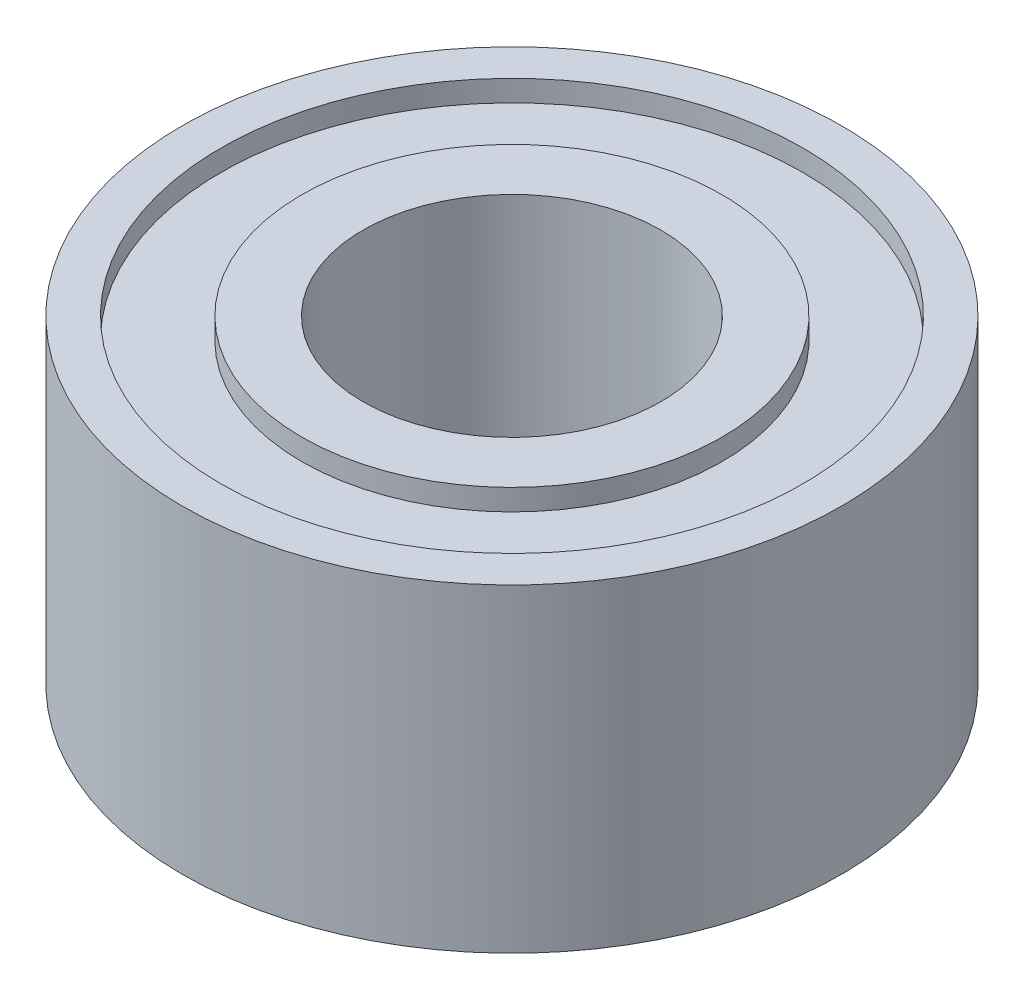
ISO-10303-21;
HEADER;
FILE_DESCRIPTION(('STEP AP214'),'2;1');
FILE_NAME('part.step','',(''),(''),'','','');
FILE_SCHEMA(('AUTOMOTIVE_DESIGN { 1 0 10303 214 1 1 1 1 }'));
ENDSEC;
DATA;
#1=APPLICATION_CONTEXT('core data for automotive mechanical design processes');
#2=APPLICATION_PROTOCOL_DEFINITION('international standard','automotive_design',2000,#1);
#3=PRODUCT_CONTEXT('',#1,'mechanical');
#4=PRODUCT('Part','Part','',(#3));
#5=PRODUCT_RELATED_PRODUCT_CATEGORY('part','',(#4));
#6=PRODUCT_DEFINITION_FORMATION('','',#4);
#7=PRODUCT_DEFINITION_CONTEXT('part definition',#1,'design');
#8=PRODUCT_DEFINITION('design','',#6,#7);
#9=PRODUCT_DEFINITION_SHAPE('','',#8);
#10=(LENGTH_UNIT() NAMED_UNIT(*) SI_UNIT(.MILLI.,.METRE.));
#11=(NAMED_UNIT(*) PLANE_ANGLE_UNIT() SI_UNIT($,.RADIAN.));
#12=(NAMED_UNIT(*) SI_UNIT($,.STERADIAN.) SOLID_ANGLE_UNIT());
#13=UNCERTAINTY_MEASURE_WITH_UNIT(LENGTH_MEASURE(1.E-05),#10,'distance_accuracy_value','');
#14=(GEOMETRIC_REPRESENTATION_CONTEXT(3) GLOBAL_UNCERTAINTY_ASSIGNED_CONTEXT((#13)) GLOBAL_UNIT_ASSIGNED_CONTEXT((#10,
#11,#12)) REPRESENTATION_CONTEXT('',''));
#15=CARTESIAN_POINT('',(0.,0.,0.));
#16=DIRECTION('',(0.,0.,1.));
#17=DIRECTION('',(1.,0.,0.));
#18=AXIS2_PLACEMENT_3D('',#15,#16,#17);
#19=CARTESIAN_POINT('',(0.,0.,0.));
#20=DIRECTION('',(0.,1.,0.));
#21=DIRECTION('',(0.,0.,1.));
#22=AXIS2_PLACEMENT_3D('',#19,#20,#21);
#23=PLANE('',#22);
#24=CARTESIAN_POINT('',(0.,0.,0.));
#25=DIRECTION('',(0.,1.,0.));
#26=DIRECTION('',(0.,0.,1.));
#27=AXIS2_PLACEMENT_3D('',#24,#25,#26);
#28=CIRCLE('',#27,7.);
#29=CARTESIAN_POINT('',(0.,0.,7.));
#30=VERTEX_POINT('',#29);
#31=EDGE_CURVE('E44',#30,#30,#28,.T.);
#32=ORIENTED_EDGE('',*,*,#31,.T.);
#33=EDGE_LOOP('',(#32));
#34=FACE_BOUND('',#33,.T.);
#35=CARTESIAN_POINT('',(0.,0.,0.));
#36=DIRECTION('',(0.,-1.,0.));
#37=DIRECTION('',(0.,0.,-1.));
#38=AXIS2_PLACEMENT_3D('',#35,#36,#37);
#39=CIRCLE('',#38,9.87953216799572);
#40=CARTESIAN_POINT('',(0.,0.,-9.87953216799572));
#41=VERTEX_POINT('',#40);
#42=EDGE_CURVE('E68',#41,#41,#39,.T.);
#43=ORIENTED_EDGE('',*,*,#42,.T.);
#44=EDGE_LOOP('',(#43));
#45=FACE_BOUND('',#44,.T.);
#46=ADVANCED_FACE('F31',(#34,#45),#23,.F.);
#47=CARTESIAN_POINT('',(0.,15.,0.));
#48=DIRECTION('',(0.,1.,0.));
#49=DIRECTION('',(0.,0.,1.));
#50=AXIS2_PLACEMENT_3D('',#47,#48,#49);
#51=PLANE('',#50);
#52=CARTESIAN_POINT('',(0.,15.,0.));
#53=DIRECTION('',(0.,1.,0.));
#54=DIRECTION('',(0.,0.,1.));
#55=AXIS2_PLACEMENT_3D('',#52,#53,#54);
#56=CIRCLE('',#55,7.);
#57=CARTESIAN_POINT('',(0.,15.,7.));
#58=VERTEX_POINT('',#57);
#59=EDGE_CURVE('E42',#58,#58,#56,.T.);
#60=ORIENTED_EDGE('',*,*,#59,.F.);
#61=EDGE_LOOP('',(#60));
#62=FACE_BOUND('',#61,.T.);
#63=CARTESIAN_POINT('',(0.,15.,0.));
#64=DIRECTION('',(0.,1.,0.));
#65=DIRECTION('',(0.,0.,1.));
#66=AXIS2_PLACEMENT_3D('',#63,#64,#65);
#67=CIRCLE('',#66,9.87953216799572);
#68=CARTESIAN_POINT('',(0.,15.,9.87953216799572));
#69=VERTEX_POINT('',#68);
#70=EDGE_CURVE('E56',#69,#69,#67,.T.);
#71=ORIENTED_EDGE('',*,*,#70,.T.);
#72=EDGE_LOOP('',(#71));
#73=FACE_BOUND('',#72,.T.);
#74=ADVANCED_FACE('F106',(#62,#73),#51,.T.);
#75=CARTESIAN_POINT('',(0.,15.,0.));
#76=DIRECTION('',(0.,1.,0.));
#77=DIRECTION('',(0.,0.,1.));
#78=AXIS2_PLACEMENT_3D('',#75,#76,#77);
#79=CIRCLE('',#78,13.6842569872599);
#80=CARTESIAN_POINT('',(0.,15.,13.6842569872599));
#81=VERTEX_POINT('',#80);
#82=EDGE_CURVE('E50',#81,#81,#79,.T.);
#83=ORIENTED_EDGE('',*,*,#82,.F.);
#84=EDGE_LOOP('',(#83));
#85=FACE_BOUND('',#84,.T.);
#86=CARTESIAN_POINT('',(0.,15.,0.));
#87=DIRECTION('',(0.,1.,0.));
#88=DIRECTION('',(0.,0.,1.));
#89=AXIS2_PLACEMENT_3D('',#86,#87,#88);
#90=CIRCLE('',#89,15.5);
#91=CARTESIAN_POINT('',(0.,15.,15.5));
#92=VERTEX_POINT('',#91);
#93=EDGE_CURVE('E10',#92,#92,#90,.T.);
#94=ORIENTED_EDGE('',*,*,#93,.T.);
#95=EDGE_LOOP('',(#94));
#96=FACE_BOUND('',#95,.T.);
#97=ADVANCED_FACE('F93',(#85,#96),#51,.T.);
#98=CARTESIAN_POINT('',(0.,0.,0.));
#99=DIRECTION('',(0.,-1.,0.));
#100=DIRECTION('',(0.,0.,-1.));
#101=AXIS2_PLACEMENT_3D('',#98,#99,#100);
#102=CIRCLE('',#101,13.6842569872599);
#103=CARTESIAN_POINT('',(0.,0.,-13.6842569872599));
#104=VERTEX_POINT('',#103);
#105=EDGE_CURVE('E62',#104,#104,#102,.T.);
#106=ORIENTED_EDGE('',*,*,#105,.F.);
#107=EDGE_LOOP('',(#106));
#108=FACE_BOUND('',#107,.T.);
#109=CARTESIAN_POINT('',(0.,0.,0.));
#110=DIRECTION('',(0.,1.,0.));
#111=DIRECTION('',(0.,0.,1.));
#112=AXIS2_PLACEMENT_3D('',#109,#110,#111);
#113=CIRCLE('',#112,15.5);
#114=CARTESIAN_POINT('',(0.,0.,15.5));
#115=VERTEX_POINT('',#114);
#116=EDGE_CURVE('E35',#115,#115,#113,.T.);
#117=ORIENTED_EDGE('',*,*,#116,.F.);
#118=EDGE_LOOP('',(#117));
#119=FACE_BOUND('',#118,.T.);
#120=ADVANCED_FACE('F90',(#108,#119),#23,.F.);
#121=CARTESIAN_POINT('',(0.,15.,0.));
#122=DIRECTION('',(0.,-1.,0.));
#123=DIRECTION('',(0.,0.,-1.));
#124=AXIS2_PLACEMENT_3D('',#121,#122,#123);
#125=CYLINDRICAL_SURFACE('',#124,15.5);
#126=ORIENTED_EDGE('',*,*,#93,.F.);
#127=EDGE_LOOP('',(#126));
#128=FACE_BOUND('',#127,.T.);
#129=ORIENTED_EDGE('',*,*,#116,.T.);
#130=EDGE_LOOP('',(#129));
#131=FACE_BOUND('',#130,.T.);
#132=ADVANCED_FACE('F33',(#128,#131),#125,.T.);
#133=CARTESIAN_POINT('',(0.,15.,0.));
#134=DIRECTION('',(0.,-1.,0.));
#135=DIRECTION('',(0.,0.,-1.));
#136=AXIS2_PLACEMENT_3D('',#133,#134,#135);
#137=CYLINDRICAL_SURFACE('',#136,7.);
#138=ORIENTED_EDGE('',*,*,#59,.T.);
#139=EDGE_LOOP('',(#138));
#140=FACE_BOUND('',#139,.T.);
#141=ORIENTED_EDGE('',*,*,#31,.F.);
#142=EDGE_LOOP('',(#141));
#143=FACE_BOUND('',#142,.T.);
#144=ADVANCED_FACE('F97',(#140,#143),#137,.F.);
#145=CARTESIAN_POINT('',(0.,14.,0.));
#146=DIRECTION('',(0.,1.,0.));
#147=DIRECTION('',(0.,0.,1.));
#148=AXIS2_PLACEMENT_3D('',#145,#146,#147);
#149=CYLINDRICAL_SURFACE('',#148,13.6842569872599);
#150=CARTESIAN_POINT('',(0.,14.,0.));
#151=DIRECTION('',(0.,1.,0.));
#152=DIRECTION('',(0.,0.,1.));
#153=AXIS2_PLACEMENT_3D('',#150,#151,#152);
#154=CIRCLE('',#153,13.6842569872599);
#155=CARTESIAN_POINT('',(0.,14.,13.6842569872599));
#156=VERTEX_POINT('',#155);
#157=EDGE_CURVE('E47',#156,#156,#154,.T.);
#158=ORIENTED_EDGE('',*,*,#157,.F.);
#159=EDGE_LOOP('',(#158));
#160=FACE_BOUND('',#159,.T.);
#161=ORIENTED_EDGE('',*,*,#82,.T.);
#162=EDGE_LOOP('',(#161));
#163=FACE_BOUND('',#162,.T.);
#164=ADVANCED_FACE('F102',(#160,#163),#149,.F.);
#165=CARTESIAN_POINT('',(0.,14.,0.));
#166=DIRECTION('',(0.,1.,0.));
#167=DIRECTION('',(0.,0.,1.));
#168=AXIS2_PLACEMENT_3D('',#165,#166,#167);
#169=PLANE('',#168);
#170=CARTESIAN_POINT('',(0.,14.,0.));
#171=DIRECTION('',(0.,1.,0.));
#172=DIRECTION('',(0.,0.,1.));
#173=AXIS2_PLACEMENT_3D('',#170,#171,#172);
#174=CIRCLE('',#173,9.87953216799572);
#175=CARTESIAN_POINT('',(0.,14.,9.87953216799572));
#176=VERTEX_POINT('',#175);
#177=EDGE_CURVE('E53',#176,#176,#174,.T.);
#178=ORIENTED_EDGE('',*,*,#177,.F.);
#179=EDGE_LOOP('',(#178));
#180=FACE_BOUND('',#179,.T.);
#181=ORIENTED_EDGE('',*,*,#157,.T.);
#182=EDGE_LOOP('',(#181));
#183=FACE_BOUND('',#182,.T.);
#184=ADVANCED_FACE('F119',(#180,#183),#169,.T.);
#185=CARTESIAN_POINT('',(0.,14.,0.));
#186=DIRECTION('',(0.,1.,0.));
#187=DIRECTION('',(0.,0.,1.));
#188=AXIS2_PLACEMENT_3D('',#185,#186,#187);
#189=CYLINDRICAL_SURFACE('',#188,9.87953216799572);
#190=ORIENTED_EDGE('',*,*,#177,.T.);
#191=EDGE_LOOP('',(#190));
#192=FACE_BOUND('',#191,.T.);
#193=ORIENTED_EDGE('',*,*,#70,.F.);
#194=EDGE_LOOP('',(#193));
#195=FACE_BOUND('',#194,.T.);
#196=ADVANCED_FACE('F86',(#192,#195),#189,.T.);
#197=CARTESIAN_POINT('',(0.,1.,0.));
#198=DIRECTION('',(0.,-1.,0.));
#199=DIRECTION('',(0.,0.,-1.));
#200=AXIS2_PLACEMENT_3D('',#197,#198,#199);
#201=CYLINDRICAL_SURFACE('',#200,13.6842569872599);
#202=CARTESIAN_POINT('',(0.,1.,0.));
#203=DIRECTION('',(0.,-1.,0.));
#204=DIRECTION('',(0.,0.,-1.));
#205=AXIS2_PLACEMENT_3D('',#202,#203,#204);
#206=CIRCLE('',#205,13.6842569872599);
#207=CARTESIAN_POINT('',(0.,1.,-13.6842569872599));
#208=VERTEX_POINT('',#207);
#209=EDGE_CURVE('E59',#208,#208,#206,.T.);
#210=ORIENTED_EDGE('',*,*,#209,.F.);
#211=EDGE_LOOP('',(#210));
#212=FACE_BOUND('',#211,.T.);
#213=ORIENTED_EDGE('',*,*,#105,.T.);
#214=EDGE_LOOP('',(#213));
#215=FACE_BOUND('',#214,.T.);
#216=ADVANCED_FACE('F80',(#212,#215),#201,.F.);
#217=CARTESIAN_POINT('',(0.,1.,0.));
#218=DIRECTION('',(0.,-1.,0.));
#219=DIRECTION('',(0.,0.,-1.));
#220=AXIS2_PLACEMENT_3D('',#217,#218,#219);
#221=PLANE('',#220);
#222=CARTESIAN_POINT('',(0.,1.,0.));
#223=DIRECTION('',(0.,-1.,0.));
#224=DIRECTION('',(0.,0.,-1.));
#225=AXIS2_PLACEMENT_3D('',#222,#223,#224);
#226=CIRCLE('',#225,9.87953216799572);
#227=CARTESIAN_POINT('',(0.,1.,-9.87953216799572));
#228=VERTEX_POINT('',#227);
#229=EDGE_CURVE('E65',#228,#228,#226,.T.);
#230=ORIENTED_EDGE('',*,*,#229,.F.);
#231=EDGE_LOOP('',(#230));
#232=FACE_BOUND('',#231,.T.);
#233=ORIENTED_EDGE('',*,*,#209,.T.);
#234=EDGE_LOOP('',(#233));
#235=FACE_BOUND('',#234,.T.);
#236=ADVANCED_FACE('F77',(#232,#235),#221,.T.);
#237=CARTESIAN_POINT('',(0.,1.,0.));
#238=DIRECTION('',(0.,-1.,0.));
#239=DIRECTION('',(0.,0.,-1.));
#240=AXIS2_PLACEMENT_3D('',#237,#238,#239);
#241=CYLINDRICAL_SURFACE('',#240,9.87953216799572);
#242=ORIENTED_EDGE('',*,*,#229,.T.);
#243=EDGE_LOOP('',(#242));
#244=FACE_BOUND('',#243,.T.);
#245=ORIENTED_EDGE('',*,*,#42,.F.);
#246=EDGE_LOOP('',(#245));
#247=FACE_BOUND('',#246,.T.);
#248=ADVANCED_FACE('F74',(#244,#247),#241,.T.);
#249=CLOSED_SHELL('',(#46,#74,#97,#120,#132,#144,#164,#184,#196,#216,#236,#248));
#250=MANIFOLD_SOLID_BREP('B2',#249);
#251=ADVANCED_BREP_SHAPE_REPRESENTATION('',(#18,#250),#14);
#252=SHAPE_DEFINITION_REPRESENTATION(#9,#251);
ENDSEC;
END-ISO-10303-21;
